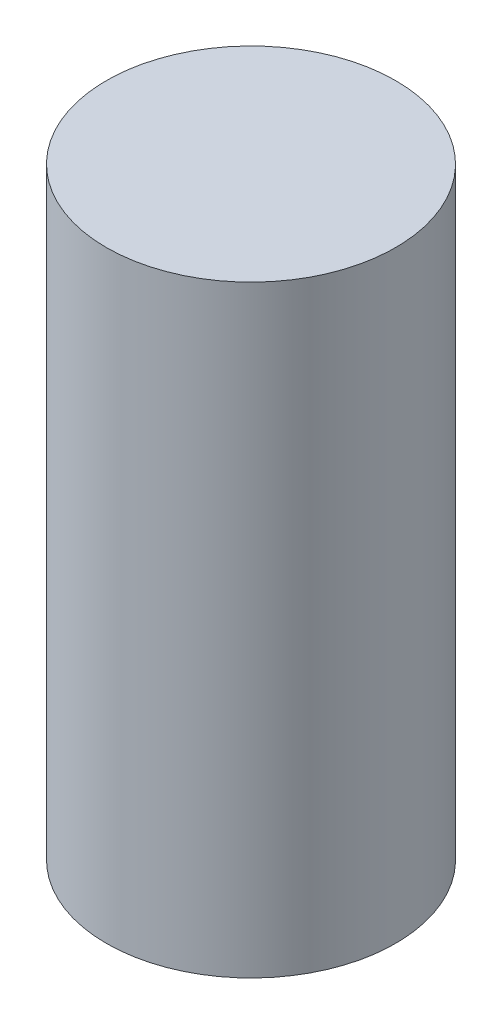
ISO-10303-21;
HEADER;
FILE_DESCRIPTION(('STEP AP214'),'2;1');
FILE_NAME('part.step','',(''),(''),'','','');
FILE_SCHEMA(('AUTOMOTIVE_DESIGN { 1 0 10303 214 1 1 1 1 }'));
ENDSEC;
DATA;
#1=APPLICATION_CONTEXT('core data for automotive mechanical design processes');
#2=APPLICATION_PROTOCOL_DEFINITION('international standard','automotive_design',2000,#1);
#3=PRODUCT_CONTEXT('',#1,'mechanical');
#4=PRODUCT('Part','Part','',(#3));
#5=PRODUCT_RELATED_PRODUCT_CATEGORY('part','',(#4));
#6=PRODUCT_DEFINITION_FORMATION('','',#4);
#7=PRODUCT_DEFINITION_CONTEXT('part definition',#1,'design');
#8=PRODUCT_DEFINITION('design','',#6,#7);
#9=PRODUCT_DEFINITION_SHAPE('','',#8);
#10=(LENGTH_UNIT() NAMED_UNIT(*) SI_UNIT(.MILLI.,.METRE.));
#11=(NAMED_UNIT(*) PLANE_ANGLE_UNIT() SI_UNIT($,.RADIAN.));
#12=(NAMED_UNIT(*) SI_UNIT($,.STERADIAN.) SOLID_ANGLE_UNIT());
#13=UNCERTAINTY_MEASURE_WITH_UNIT(LENGTH_MEASURE(1.E-05),#10,'distance_accuracy_value','');
#14=(GEOMETRIC_REPRESENTATION_CONTEXT(3) GLOBAL_UNCERTAINTY_ASSIGNED_CONTEXT((#13)) GLOBAL_UNIT_ASSIGNED_CONTEXT((#10,
#11,#12)) REPRESENTATION_CONTEXT('',''));
#15=CARTESIAN_POINT('',(0.,0.,0.));
#16=DIRECTION('',(0.,0.,1.));
#17=DIRECTION('',(1.,0.,0.));
#18=AXIS2_PLACEMENT_3D('',#15,#16,#17);
#19=CARTESIAN_POINT('',(0.,2.,0.));
#20=DIRECTION('',(0.,-1.,0.));
#21=DIRECTION('',(0.,0.,-1.));
#22=AXIS2_PLACEMENT_3D('',#19,#20,#21);
#23=CYLINDRICAL_SURFACE('',#22,0.48);
#24=CARTESIAN_POINT('',(0.,2.,0.));
#25=DIRECTION('',(0.,1.,0.));
#26=DIRECTION('',(0.,0.,1.));
#27=AXIS2_PLACEMENT_3D('',#24,#25,#26);
#28=CIRCLE('',#27,0.48);
#29=CARTESIAN_POINT('',(0.,2.,0.48));
#30=VERTEX_POINT('',#29);
#31=EDGE_CURVE('E10',#30,#30,#28,.T.);
#32=ORIENTED_EDGE('',*,*,#31,.F.);
#33=EDGE_LOOP('',(#32));
#34=FACE_BOUND('',#33,.T.);
#35=CARTESIAN_POINT('',(0.,0.,0.));
#36=DIRECTION('',(0.,1.,0.));
#37=DIRECTION('',(0.,0.,1.));
#38=AXIS2_PLACEMENT_3D('',#35,#36,#37);
#39=CIRCLE('',#38,0.48);
#40=CARTESIAN_POINT('',(0.,0.,0.48));
#41=VERTEX_POINT('',#40);
#42=EDGE_CURVE('E34',#41,#41,#39,.T.);
#43=ORIENTED_EDGE('',*,*,#42,.T.);
#44=EDGE_LOOP('',(#43));
#45=FACE_BOUND('',#44,.T.);
#46=ADVANCED_FACE('F31',(#34,#45),#23,.T.);
#47=CARTESIAN_POINT('',(0.,2.,0.));
#48=DIRECTION('',(0.,1.,0.));
#49=DIRECTION('',(0.,0.,1.));
#50=AXIS2_PLACEMENT_3D('',#47,#48,#49);
#51=PLANE('',#50);
#52=ORIENTED_EDGE('',*,*,#31,.T.);
#53=EDGE_LOOP('',(#52));
#54=FACE_BOUND('',#53,.T.);
#55=ADVANCED_FACE('F46',(#54),#51,.T.);
#56=CARTESIAN_POINT('',(0.,0.,0.));
#57=DIRECTION('',(0.,1.,0.));
#58=DIRECTION('',(0.,0.,1.));
#59=AXIS2_PLACEMENT_3D('',#56,#57,#58);
#60=PLANE('',#59);
#61=ORIENTED_EDGE('',*,*,#42,.F.);
#62=EDGE_LOOP('',(#61));
#63=FACE_BOUND('',#62,.T.);
#64=ADVANCED_FACE('F44',(#63),#60,.F.);
#65=CLOSED_SHELL('',(#46,#55,#64));
#66=MANIFOLD_SOLID_BREP('B2',#65);
#67=ADVANCED_BREP_SHAPE_REPRESENTATION('',(#18,#66),#14);
#68=SHAPE_DEFINITION_REPRESENTATION(#9,#67);
ENDSEC;
END-ISO-10303-21;
